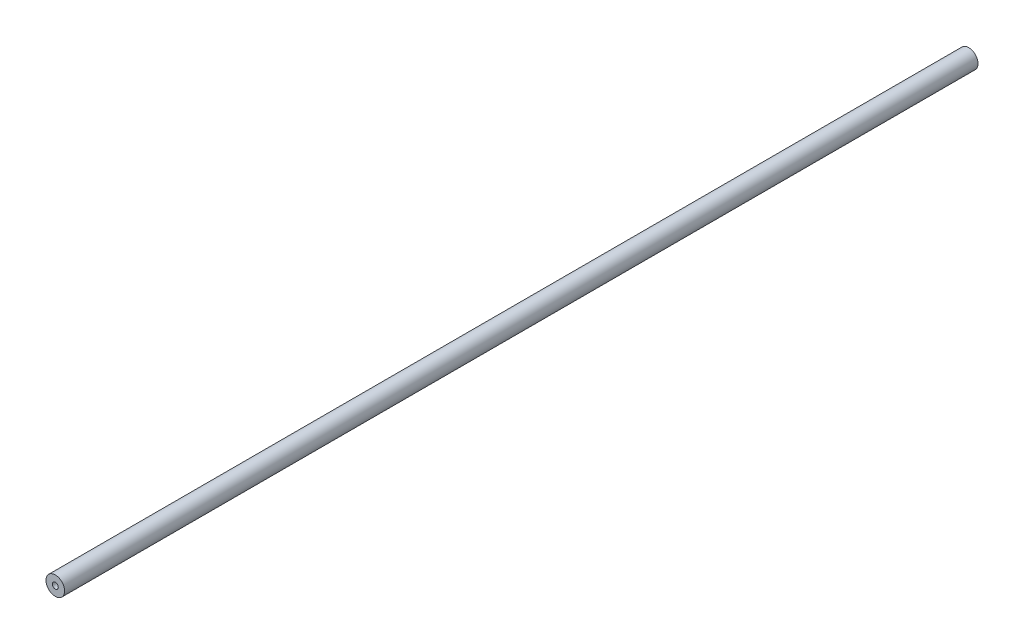
ISO-10303-21;
HEADER;
FILE_DESCRIPTION(('STEP AP214'),'2;1');
FILE_NAME('part.step','',(''),(''),'','','');
FILE_SCHEMA(('AUTOMOTIVE_DESIGN { 1 0 10303 214 1 1 1 1 }'));
ENDSEC;
DATA;
#1=APPLICATION_CONTEXT('core data for automotive mechanical design processes');
#2=APPLICATION_PROTOCOL_DEFINITION('international standard','automotive_design',2000,#1);
#3=PRODUCT_CONTEXT('',#1,'mechanical');
#4=PRODUCT('Part','Part','',(#3));
#5=PRODUCT_RELATED_PRODUCT_CATEGORY('part','',(#4));
#6=PRODUCT_DEFINITION_FORMATION('','',#4);
#7=PRODUCT_DEFINITION_CONTEXT('part definition',#1,'design');
#8=PRODUCT_DEFINITION('design','',#6,#7);
#9=PRODUCT_DEFINITION_SHAPE('','',#8);
#10=(LENGTH_UNIT() NAMED_UNIT(*) SI_UNIT(.MILLI.,.METRE.));
#11=(NAMED_UNIT(*) PLANE_ANGLE_UNIT() SI_UNIT($,.RADIAN.));
#12=(NAMED_UNIT(*) SI_UNIT($,.STERADIAN.) SOLID_ANGLE_UNIT());
#13=UNCERTAINTY_MEASURE_WITH_UNIT(LENGTH_MEASURE(1.E-05),#10,'distance_accuracy_value','');
#14=(GEOMETRIC_REPRESENTATION_CONTEXT(3) GLOBAL_UNCERTAINTY_ASSIGNED_CONTEXT((#13)) GLOBAL_UNIT_ASSIGNED_CONTEXT((#10,
#11,#12)) REPRESENTATION_CONTEXT('',''));
#15=CARTESIAN_POINT('',(0.,0.,0.));
#16=DIRECTION('',(0.,0.,1.));
#17=DIRECTION('',(1.,0.,0.));
#18=AXIS2_PLACEMENT_3D('',#15,#16,#17);
#19=CARTESIAN_POINT('',(0.,0.,622.808));
#20=DIRECTION('',(0.,0.,-1.));
#21=DIRECTION('',(-1.,0.,0.));
#22=AXIS2_PLACEMENT_3D('',#19,#20,#21);
#23=CYLINDRICAL_SURFACE('',#22,6.35);
#24=CARTESIAN_POINT('',(0.,0.,622.808));
#25=DIRECTION('',(0.,0.,1.));
#26=DIRECTION('',(1.,0.,0.));
#27=AXIS2_PLACEMENT_3D('',#24,#25,#26);
#28=CIRCLE('',#27,6.35);
#29=CARTESIAN_POINT('',(6.35,0.,622.808));
#30=VERTEX_POINT('',#29);
#31=EDGE_CURVE('E11',#30,#30,#28,.T.);
#32=ORIENTED_EDGE('',*,*,#31,.F.);
#33=EDGE_LOOP('',(#32));
#34=FACE_BOUND('',#33,.T.);
#35=CARTESIAN_POINT('',(0.,0.,0.));
#36=DIRECTION('',(0.,0.,1.));
#37=DIRECTION('',(1.,0.,0.));
#38=AXIS2_PLACEMENT_3D('',#35,#36,#37);
#39=CIRCLE('',#38,6.35);
#40=CARTESIAN_POINT('',(6.35,0.,0.));
#41=VERTEX_POINT('',#40);
#42=EDGE_CURVE('E61',#41,#41,#39,.T.);
#43=ORIENTED_EDGE('',*,*,#42,.T.);
#44=EDGE_LOOP('',(#43));
#45=FACE_BOUND('',#44,.T.);
#46=ADVANCED_FACE('F58',(#34,#45),#23,.T.);
#47=CARTESIAN_POINT('',(0.,0.,622.808));
#48=DIRECTION('',(0.,0.,1.));
#49=DIRECTION('',(1.,0.,0.));
#50=AXIS2_PLACEMENT_3D('',#47,#48,#49);
#51=PLANE('',#50);
#52=CARTESIAN_POINT('',(0.,0.,622.808));
#53=DIRECTION('',(0.,0.,1.));
#54=DIRECTION('',(1.,0.,0.));
#55=AXIS2_PLACEMENT_3D('',#52,#53,#54);
#56=CIRCLE('',#55,2.0193);
#57=CARTESIAN_POINT('',(2.0193,0.,622.808));
#58=VERTEX_POINT('',#57);
#59=EDGE_CURVE('E83',#58,#58,#56,.T.);
#60=ORIENTED_EDGE('',*,*,#59,.F.);
#61=EDGE_LOOP('',(#60));
#62=FACE_BOUND('',#61,.T.);
#63=ORIENTED_EDGE('',*,*,#31,.T.);
#64=EDGE_LOOP('',(#63));
#65=FACE_BOUND('',#64,.T.);
#66=ADVANCED_FACE('F106',(#62,#65),#51,.T.);
#67=CARTESIAN_POINT('',(0.,0.,0.));
#68=DIRECTION('',(0.,0.,1.));
#69=DIRECTION('',(1.,0.,0.));
#70=AXIS2_PLACEMENT_3D('',#67,#68,#69);
#71=PLANE('',#70);
#72=CARTESIAN_POINT('',(0.,0.,0.));
#73=DIRECTION('',(0.,0.,-1.));
#74=DIRECTION('',(-1.,0.,0.));
#75=AXIS2_PLACEMENT_3D('',#72,#73,#74);
#76=CIRCLE('',#75,2.01929999999999);
#77=CARTESIAN_POINT('',(-2.01929999999999,0.,0.));
#78=VERTEX_POINT('',#77);
#79=EDGE_CURVE('E84',#78,#78,#76,.T.);
#80=ORIENTED_EDGE('',*,*,#79,.F.);
#81=EDGE_LOOP('',(#80));
#82=FACE_BOUND('',#81,.T.);
#83=ORIENTED_EDGE('',*,*,#42,.F.);
#84=EDGE_LOOP('',(#83));
#85=FACE_BOUND('',#84,.T.);
#86=ADVANCED_FACE('F103',(#82,#85),#71,.F.);
#87=CARTESIAN_POINT('',(0.,0.,609.092));
#88=DIRECTION('',(0.,0.,1.));
#89=DIRECTION('',(1.,0.,0.));
#90=AXIS2_PLACEMENT_3D('',#87,#88,#89);
#91=CONICAL_SURFACE('',#90,2.0193,1.02974425867664);
#92=CARTESIAN_POINT('',(0.,0.,607.878682151998));
#93=VERTEX_POINT('',#92);
#94=VERTEX_LOOP('',#93);
#95=FACE_BOUND('',#94,.T.);
#96=CARTESIAN_POINT('',(0.,0.,609.092));
#97=DIRECTION('',(0.,0.,1.));
#98=DIRECTION('',(1.,0.,0.));
#99=AXIS2_PLACEMENT_3D('',#96,#97,#98);
#100=CIRCLE('',#99,2.0193);
#101=CARTESIAN_POINT('',(2.0193,0.,609.092));
#102=VERTEX_POINT('',#101);
#103=EDGE_CURVE('E89',#102,#102,#100,.T.);
#104=ORIENTED_EDGE('',*,*,#103,.T.);
#105=EDGE_LOOP('',(#104));
#106=FACE_BOUND('',#105,.T.);
#107=ADVANCED_FACE('F105',(#95,#106),#91,.F.);
#108=CARTESIAN_POINT('',(0.,0.,622.808));
#109=DIRECTION('',(0.,0.,1.));
#110=DIRECTION('',(1.,0.,0.));
#111=AXIS2_PLACEMENT_3D('',#108,#109,#110);
#112=CYLINDRICAL_SURFACE('',#111,2.0193);
#113=ORIENTED_EDGE('',*,*,#103,.F.);
#114=EDGE_LOOP('',(#113));
#115=FACE_BOUND('',#114,.T.);
#116=ORIENTED_EDGE('',*,*,#59,.T.);
#117=EDGE_LOOP('',(#116));
#118=FACE_BOUND('',#117,.T.);
#119=ADVANCED_FACE('F76',(#115,#118),#112,.F.);
#120=CARTESIAN_POINT('',(0.,0.,13.716));
#121=DIRECTION('',(0.,0.,-1.));
#122=DIRECTION('',(-1.,0.,0.));
#123=AXIS2_PLACEMENT_3D('',#120,#121,#122);
#124=CONICAL_SURFACE('',#123,2.01929999999999,1.02974425867665);
#125=CARTESIAN_POINT('',(0.,0.,14.9293178480024));
#126=VERTEX_POINT('',#125);
#127=VERTEX_LOOP('',#126);
#128=FACE_BOUND('',#127,.T.);
#129=CARTESIAN_POINT('',(0.,0.,13.716));
#130=DIRECTION('',(0.,0.,-1.));
#131=DIRECTION('',(-1.,0.,0.));
#132=AXIS2_PLACEMENT_3D('',#129,#130,#131);
#133=CIRCLE('',#132,2.01929999999999);
#134=CARTESIAN_POINT('',(-2.01929999999999,0.,13.716));
#135=VERTEX_POINT('',#134);
#136=EDGE_CURVE('E80',#135,#135,#133,.T.);
#137=ORIENTED_EDGE('',*,*,#136,.T.);
#138=EDGE_LOOP('',(#137));
#139=FACE_BOUND('',#138,.T.);
#140=ADVANCED_FACE('F72',(#128,#139),#124,.F.);
#141=CARTESIAN_POINT('',(0.,0.,0.));
#142=DIRECTION('',(0.,0.,-1.));
#143=DIRECTION('',(-1.,0.,0.));
#144=AXIS2_PLACEMENT_3D('',#141,#142,#143);
#145=CYLINDRICAL_SURFACE('',#144,2.01929999999999);
#146=ORIENTED_EDGE('',*,*,#136,.F.);
#147=EDGE_LOOP('',(#146));
#148=FACE_BOUND('',#147,.T.);
#149=ORIENTED_EDGE('',*,*,#79,.T.);
#150=EDGE_LOOP('',(#149));
#151=FACE_BOUND('',#150,.T.);
#152=ADVANCED_FACE('F75',(#148,#151),#145,.F.);
#153=CLOSED_SHELL('',(#46,#66,#86,#107,#119,#140,#152));
#154=MANIFOLD_SOLID_BREP('B2',#153);
#155=ADVANCED_BREP_SHAPE_REPRESENTATION('',(#18,#154),#14);
#156=SHAPE_DEFINITION_REPRESENTATION(#9,#155);
ENDSEC;
END-ISO-10303-21;
